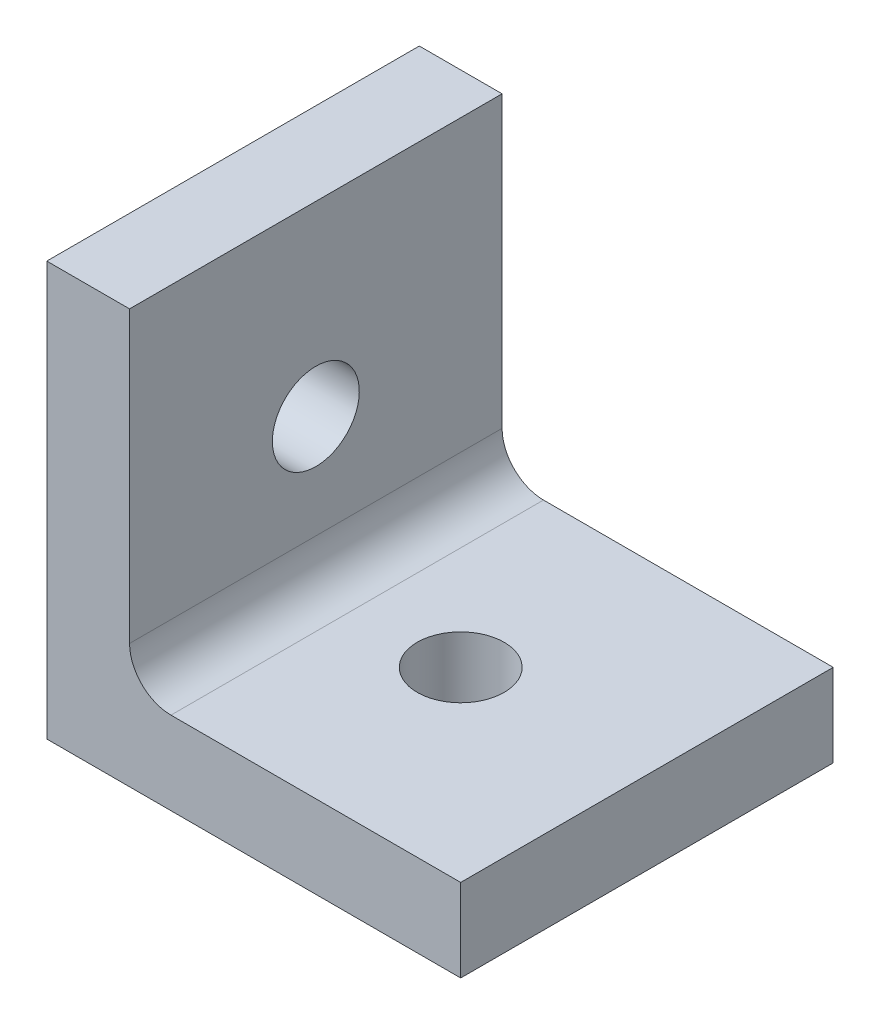
ISO-10303-21;
HEADER;
FILE_DESCRIPTION(('STEP AP214'),'2;1');
FILE_NAME('part.step','',(''),(''),'','','');
FILE_SCHEMA(('AUTOMOTIVE_DESIGN { 1 0 10303 214 1 1 1 1 }'));
ENDSEC;
DATA;
#1=APPLICATION_CONTEXT('core data for automotive mechanical design processes');
#2=APPLICATION_PROTOCOL_DEFINITION('international standard','automotive_design',2000,#1);
#3=PRODUCT_CONTEXT('',#1,'mechanical');
#4=PRODUCT('Part','Part','',(#3));
#5=PRODUCT_RELATED_PRODUCT_CATEGORY('part','',(#4));
#6=PRODUCT_DEFINITION_FORMATION('','',#4);
#7=PRODUCT_DEFINITION_CONTEXT('part definition',#1,'design');
#8=PRODUCT_DEFINITION('design','',#6,#7);
#9=PRODUCT_DEFINITION_SHAPE('','',#8);
#10=(LENGTH_UNIT() NAMED_UNIT(*) SI_UNIT(.MILLI.,.METRE.));
#11=(NAMED_UNIT(*) PLANE_ANGLE_UNIT() SI_UNIT($,.RADIAN.));
#12=(NAMED_UNIT(*) SI_UNIT($,.STERADIAN.) SOLID_ANGLE_UNIT());
#13=UNCERTAINTY_MEASURE_WITH_UNIT(LENGTH_MEASURE(1.E-05),#10,'distance_accuracy_value','');
#14=(GEOMETRIC_REPRESENTATION_CONTEXT(3) GLOBAL_UNCERTAINTY_ASSIGNED_CONTEXT((#13)) GLOBAL_UNIT_ASSIGNED_CONTEXT((#10,
#11,#12)) REPRESENTATION_CONTEXT('',''));
#15=CARTESIAN_POINT('',(0.,0.,0.));
#16=DIRECTION('',(0.,0.,1.));
#17=DIRECTION('',(1.,0.,0.));
#18=AXIS2_PLACEMENT_3D('',#15,#16,#17);
#19=CARTESIAN_POINT('',(0.,0.,18.));
#20=DIRECTION('',(1.,0.,0.));
#21=DIRECTION('',(0.,0.,-1.));
#22=AXIS2_PLACEMENT_3D('',#19,#20,#21);
#23=PLANE('',#22);
#24=CARTESIAN_POINT('',(0.,11.,9.));
#25=DIRECTION('',(1.,0.,0.));
#26=DIRECTION('',(0.,1.,0.));
#27=AXIS2_PLACEMENT_3D('',#24,#25,#26);
#28=CIRCLE('',#27,2.1);
#29=CARTESIAN_POINT('',(0.,13.1,9.));
#30=VERTEX_POINT('',#29);
#31=EDGE_CURVE('E164',#30,#30,#28,.T.);
#32=ORIENTED_EDGE('',*,*,#31,.T.);
#33=EDGE_LOOP('',(#32));
#34=FACE_BOUND('',#33,.T.);
#35=DIRECTION('',(0.,-1.,0.));
#36=VECTOR('',#35,1.);
#37=CARTESIAN_POINT('',(0.,0.,0.));
#38=LINE('',#37,#36);
#39=CARTESIAN_POINT('',(0.,20.,0.));
#40=VERTEX_POINT('',#39);
#41=CARTESIAN_POINT('',(0.,0.,0.));
#42=VERTEX_POINT('',#41);
#43=EDGE_CURVE('E124',#40,#42,#38,.T.);
#44=ORIENTED_EDGE('',*,*,#43,.T.);
#45=DIRECTION('',(0.,0.,-1.));
#46=VECTOR('',#45,1.);
#47=CARTESIAN_POINT('',(0.,0.,18.));
#48=LINE('',#47,#46);
#49=CARTESIAN_POINT('',(0.,0.,18.));
#50=VERTEX_POINT('',#49);
#51=EDGE_CURVE('E103',#50,#42,#48,.T.);
#52=ORIENTED_EDGE('',*,*,#51,.F.);
#53=DIRECTION('',(0.,-1.,0.));
#54=VECTOR('',#53,1.);
#55=CARTESIAN_POINT('',(0.,0.,18.));
#56=LINE('',#55,#54);
#57=CARTESIAN_POINT('',(0.,20.,18.));
#58=VERTEX_POINT('',#57);
#59=EDGE_CURVE('E111',#58,#50,#56,.T.);
#60=ORIENTED_EDGE('',*,*,#59,.F.);
#61=DIRECTION('',(0.,0.,-1.));
#62=VECTOR('',#61,1.);
#63=CARTESIAN_POINT('',(0.,20.,18.));
#64=LINE('',#63,#62);
#65=EDGE_CURVE('E145',#58,#40,#64,.T.);
#66=ORIENTED_EDGE('',*,*,#65,.T.);
#67=EDGE_LOOP('',(#44,#52,#60,#66));
#68=FACE_BOUND('',#67,.T.);
#69=ADVANCED_FACE('F39',(#34,#68),#23,.F.);
#70=CARTESIAN_POINT('',(0.,0.,18.));
#71=DIRECTION('',(0.,1.,0.));
#72=DIRECTION('',(0.,0.,1.));
#73=AXIS2_PLACEMENT_3D('',#70,#71,#72);
#74=PLANE('',#73);
#75=CARTESIAN_POINT('',(11.,0.,9.));
#76=DIRECTION('',(0.,1.,0.));
#77=DIRECTION('',(-1.,0.,0.));
#78=AXIS2_PLACEMENT_3D('',#75,#76,#77);
#79=CIRCLE('',#78,2.1);
#80=CARTESIAN_POINT('',(8.9,0.,9.));
#81=VERTEX_POINT('',#80);
#82=EDGE_CURVE('E179',#81,#81,#79,.T.);
#83=ORIENTED_EDGE('',*,*,#82,.T.);
#84=EDGE_LOOP('',(#83));
#85=FACE_BOUND('',#84,.T.);
#86=DIRECTION('',(1.,0.,0.));
#87=VECTOR('',#86,1.);
#88=CARTESIAN_POINT('',(0.,0.,0.));
#89=LINE('',#88,#87);
#90=CARTESIAN_POINT('',(20.,0.,0.));
#91=VERTEX_POINT('',#90);
#92=EDGE_CURVE('E159',#42,#91,#89,.T.);
#93=ORIENTED_EDGE('',*,*,#92,.T.);
#94=DIRECTION('',(0.,0.,-1.));
#95=VECTOR('',#94,1.);
#96=CARTESIAN_POINT('',(20.,0.,18.));
#97=LINE('',#96,#95);
#98=CARTESIAN_POINT('',(20.,0.,18.));
#99=VERTEX_POINT('',#98);
#100=EDGE_CURVE('E106',#99,#91,#97,.T.);
#101=ORIENTED_EDGE('',*,*,#100,.F.);
#102=DIRECTION('',(1.,0.,0.));
#103=VECTOR('',#102,1.);
#104=CARTESIAN_POINT('',(0.,0.,18.));
#105=LINE('',#104,#103);
#106=EDGE_CURVE('E99',#50,#99,#105,.T.);
#107=ORIENTED_EDGE('',*,*,#106,.F.);
#108=ORIENTED_EDGE('',*,*,#51,.T.);
#109=EDGE_LOOP('',(#93,#101,#107,#108));
#110=FACE_BOUND('',#109,.T.);
#111=ADVANCED_FACE('F101',(#85,#110),#74,.F.);
#112=CARTESIAN_POINT('',(20.,0.,18.));
#113=DIRECTION('',(-1.,0.,0.));
#114=DIRECTION('',(0.,-1.,0.));
#115=AXIS2_PLACEMENT_3D('',#112,#113,#114);
#116=PLANE('',#115);
#117=DIRECTION('',(0.,1.,0.));
#118=VECTOR('',#117,1.);
#119=CARTESIAN_POINT('',(20.,0.,0.));
#120=LINE('',#119,#118);
#121=CARTESIAN_POINT('',(20.,4.,0.));
#122=VERTEX_POINT('',#121);
#123=EDGE_CURVE('E156',#91,#122,#120,.T.);
#124=ORIENTED_EDGE('',*,*,#123,.T.);
#125=DIRECTION('',(0.,0.,-1.));
#126=VECTOR('',#125,1.);
#127=CARTESIAN_POINT('',(20.,4.,18.));
#128=LINE('',#127,#126);
#129=CARTESIAN_POINT('',(20.,4.,18.));
#130=VERTEX_POINT('',#129);
#131=EDGE_CURVE('E132',#130,#122,#128,.T.);
#132=ORIENTED_EDGE('',*,*,#131,.F.);
#133=DIRECTION('',(0.,1.,0.));
#134=VECTOR('',#133,1.);
#135=CARTESIAN_POINT('',(20.,0.,18.));
#136=LINE('',#135,#134);
#137=EDGE_CURVE('E110',#99,#130,#136,.T.);
#138=ORIENTED_EDGE('',*,*,#137,.F.);
#139=ORIENTED_EDGE('',*,*,#100,.T.);
#140=EDGE_LOOP('',(#124,#132,#138,#139));
#141=FACE_BOUND('',#140,.T.);
#142=ADVANCED_FACE('F202',(#141),#116,.F.);
#143=CARTESIAN_POINT('',(20.,4.,18.));
#144=DIRECTION('',(0.,-1.,0.));
#145=DIRECTION('',(1.,0.,0.));
#146=AXIS2_PLACEMENT_3D('',#143,#144,#145);
#147=PLANE('',#146);
#148=CARTESIAN_POINT('',(11.,4.,9.));
#149=DIRECTION('',(0.,1.,0.));
#150=DIRECTION('',(-1.,0.,0.));
#151=AXIS2_PLACEMENT_3D('',#148,#149,#150);
#152=CIRCLE('',#151,2.1);
#153=CARTESIAN_POINT('',(8.9,4.,9.));
#154=VERTEX_POINT('',#153);
#155=EDGE_CURVE('E183',#154,#154,#152,.T.);
#156=ORIENTED_EDGE('',*,*,#155,.F.);
#157=EDGE_LOOP('',(#156));
#158=FACE_BOUND('',#157,.T.);
#159=DIRECTION('',(-1.,0.,0.));
#160=VECTOR('',#159,1.);
#161=CARTESIAN_POINT('',(20.,4.,0.));
#162=LINE('',#161,#160);
#163=CARTESIAN_POINT('',(6.,4.,0.));
#164=VERTEX_POINT('',#163);
#165=EDGE_CURVE('E153',#122,#164,#162,.T.);
#166=ORIENTED_EDGE('',*,*,#165,.T.);
#167=DIRECTION('',(0.,0.,-1.));
#168=VECTOR('',#167,1.);
#169=CARTESIAN_POINT('',(6.,4.,18.));
#170=LINE('',#169,#168);
#171=CARTESIAN_POINT('',(6.,4.,18.));
#172=VERTEX_POINT('',#171);
#173=EDGE_CURVE('E55',#164,#172,#170,.F.);
#174=ORIENTED_EDGE('',*,*,#173,.T.);
#175=DIRECTION('',(-1.,0.,0.));
#176=VECTOR('',#175,1.);
#177=CARTESIAN_POINT('',(20.,4.,18.));
#178=LINE('',#177,#176);
#179=EDGE_CURVE('E170',#130,#172,#178,.T.);
#180=ORIENTED_EDGE('',*,*,#179,.F.);
#181=ORIENTED_EDGE('',*,*,#131,.T.);
#182=EDGE_LOOP('',(#166,#174,#180,#181));
#183=FACE_BOUND('',#182,.T.);
#184=ADVANCED_FACE('F199',(#158,#183),#147,.F.);
#185=CARTESIAN_POINT('',(4.,20.,18.));
#186=DIRECTION('',(-1.,0.,0.));
#187=DIRECTION('',(0.,-1.,0.));
#188=AXIS2_PLACEMENT_3D('',#185,#186,#187);
#189=PLANE('',#188);
#190=CARTESIAN_POINT('',(4.,11.,9.));
#191=DIRECTION('',(1.,0.,0.));
#192=DIRECTION('',(0.,1.,0.));
#193=AXIS2_PLACEMENT_3D('',#190,#191,#192);
#194=CIRCLE('',#193,2.1);
#195=CARTESIAN_POINT('',(4.,13.1,9.));
#196=VERTEX_POINT('',#195);
#197=EDGE_CURVE('E175',#196,#196,#194,.T.);
#198=ORIENTED_EDGE('',*,*,#197,.F.);
#199=EDGE_LOOP('',(#198));
#200=FACE_BOUND('',#199,.T.);
#201=DIRECTION('',(0.,1.,0.));
#202=VECTOR('',#201,1.);
#203=CARTESIAN_POINT('',(4.,20.,18.));
#204=LINE('',#203,#202);
#205=CARTESIAN_POINT('',(4.,6.,18.));
#206=VERTEX_POINT('',#205);
#207=CARTESIAN_POINT('',(4.,20.,18.));
#208=VERTEX_POINT('',#207);
#209=EDGE_CURVE('E167',#206,#208,#204,.T.);
#210=ORIENTED_EDGE('',*,*,#209,.F.);
#211=DIRECTION('',(0.,0.,-1.));
#212=VECTOR('',#211,1.);
#213=CARTESIAN_POINT('',(4.,6.,0.));
#214=LINE('',#213,#212);
#215=CARTESIAN_POINT('',(4.,6.,0.));
#216=VERTEX_POINT('',#215);
#217=EDGE_CURVE('E126',#206,#216,#214,.T.);
#218=ORIENTED_EDGE('',*,*,#217,.T.);
#219=DIRECTION('',(0.,1.,0.));
#220=VECTOR('',#219,1.);
#221=CARTESIAN_POINT('',(4.,20.,0.));
#222=LINE('',#221,#220);
#223=CARTESIAN_POINT('',(4.,20.,0.));
#224=VERTEX_POINT('',#223);
#225=EDGE_CURVE('E150',#216,#224,#222,.T.);
#226=ORIENTED_EDGE('',*,*,#225,.T.);
#227=DIRECTION('',(0.,0.,-1.));
#228=VECTOR('',#227,1.);
#229=CARTESIAN_POINT('',(4.,20.,18.));
#230=LINE('',#229,#228);
#231=EDGE_CURVE('E141',#208,#224,#230,.T.);
#232=ORIENTED_EDGE('',*,*,#231,.F.);
#233=EDGE_LOOP('',(#210,#218,#226,#232));
#234=FACE_BOUND('',#233,.T.);
#235=ADVANCED_FACE('F201',(#200,#234),#189,.F.);
#236=CARTESIAN_POINT('',(0.,20.,18.));
#237=DIRECTION('',(0.,-1.,0.));
#238=DIRECTION('',(1.,0.,0.));
#239=AXIS2_PLACEMENT_3D('',#236,#237,#238);
#240=PLANE('',#239);
#241=DIRECTION('',(-1.,0.,0.));
#242=VECTOR('',#241,1.);
#243=CARTESIAN_POINT('',(0.,20.,0.));
#244=LINE('',#243,#242);
#245=EDGE_CURVE('E121',#224,#40,#244,.T.);
#246=ORIENTED_EDGE('',*,*,#245,.T.);
#247=ORIENTED_EDGE('',*,*,#65,.F.);
#248=DIRECTION('',(-1.,0.,0.));
#249=VECTOR('',#248,1.);
#250=CARTESIAN_POINT('',(0.,20.,18.));
#251=LINE('',#250,#249);
#252=EDGE_CURVE('E116',#208,#58,#251,.T.);
#253=ORIENTED_EDGE('',*,*,#252,.F.);
#254=ORIENTED_EDGE('',*,*,#231,.T.);
#255=EDGE_LOOP('',(#246,#247,#253,#254));
#256=FACE_BOUND('',#255,.T.);
#257=ADVANCED_FACE('F214',(#256),#240,.F.);
#258=CARTESIAN_POINT('',(0.,0.,18.));
#259=DIRECTION('',(0.,0.,-1.));
#260=DIRECTION('',(-1.,0.,0.));
#261=AXIS2_PLACEMENT_3D('',#258,#259,#260);
#262=PLANE('',#261);
#263=ORIENTED_EDGE('',*,*,#59,.T.);
#264=ORIENTED_EDGE('',*,*,#106,.T.);
#265=ORIENTED_EDGE('',*,*,#137,.T.);
#266=ORIENTED_EDGE('',*,*,#179,.T.);
#267=CARTESIAN_POINT('',(6.,6.,18.));
#268=DIRECTION('',(0.,0.,-1.));
#269=DIRECTION('',(-1.,0.,0.));
#270=AXIS2_PLACEMENT_3D('',#267,#268,#269);
#271=CIRCLE('',#270,2.);
#272=EDGE_CURVE('E11',#172,#206,#271,.T.);
#273=ORIENTED_EDGE('',*,*,#272,.T.);
#274=ORIENTED_EDGE('',*,*,#209,.T.);
#275=ORIENTED_EDGE('',*,*,#252,.T.);
#276=EDGE_LOOP('',(#263,#264,#265,#266,#273,#274,#275));
#277=FACE_BOUND('',#276,.T.);
#278=ADVANCED_FACE('F114',(#277),#262,.F.);
#279=CARTESIAN_POINT('',(0.,0.,0.));
#280=DIRECTION('',(0.,0.,-1.));
#281=DIRECTION('',(-1.,0.,0.));
#282=AXIS2_PLACEMENT_3D('',#279,#280,#281);
#283=PLANE('',#282);
#284=ORIENTED_EDGE('',*,*,#43,.F.);
#285=ORIENTED_EDGE('',*,*,#245,.F.);
#286=ORIENTED_EDGE('',*,*,#225,.F.);
#287=CARTESIAN_POINT('',(6.,6.,0.));
#288=DIRECTION('',(0.,0.,-1.));
#289=DIRECTION('',(-1.,0.,0.));
#290=AXIS2_PLACEMENT_3D('',#287,#288,#289);
#291=CIRCLE('',#290,2.);
#292=EDGE_CURVE('E48',#216,#164,#291,.F.);
#293=ORIENTED_EDGE('',*,*,#292,.T.);
#294=ORIENTED_EDGE('',*,*,#165,.F.);
#295=ORIENTED_EDGE('',*,*,#123,.F.);
#296=ORIENTED_EDGE('',*,*,#92,.F.);
#297=EDGE_LOOP('',(#284,#285,#286,#293,#294,#295,#296));
#298=FACE_BOUND('',#297,.T.);
#299=ADVANCED_FACE('F215',(#298),#283,.T.);
#300=CARTESIAN_POINT('',(0.,11.,9.));
#301=DIRECTION('',(1.,0.,0.));
#302=DIRECTION('',(0.,1.,0.));
#303=AXIS2_PLACEMENT_3D('',#300,#301,#302);
#304=CYLINDRICAL_SURFACE('',#303,2.1);
#305=ORIENTED_EDGE('',*,*,#31,.F.);
#306=EDGE_LOOP('',(#305));
#307=FACE_BOUND('',#306,.T.);
#308=ORIENTED_EDGE('',*,*,#197,.T.);
#309=EDGE_LOOP('',(#308));
#310=FACE_BOUND('',#309,.T.);
#311=ADVANCED_FACE('F195',(#307,#310),#304,.F.);
#312=CARTESIAN_POINT('',(11.,0.,9.));
#313=DIRECTION('',(0.,1.,0.));
#314=DIRECTION('',(-1.,0.,0.));
#315=AXIS2_PLACEMENT_3D('',#312,#313,#314);
#316=CYLINDRICAL_SURFACE('',#315,2.1);
#317=ORIENTED_EDGE('',*,*,#82,.F.);
#318=EDGE_LOOP('',(#317));
#319=FACE_BOUND('',#318,.T.);
#320=ORIENTED_EDGE('',*,*,#155,.T.);
#321=EDGE_LOOP('',(#320));
#322=FACE_BOUND('',#321,.T.);
#323=ADVANCED_FACE('F192',(#319,#322),#316,.F.);
#324=CARTESIAN_POINT('',(6.,6.,18.));
#325=DIRECTION('',(0.,0.,1.));
#326=DIRECTION('',(1.,0.,0.));
#327=AXIS2_PLACEMENT_3D('',#324,#325,#326);
#328=CYLINDRICAL_SURFACE('',#327,2.);
#329=ORIENTED_EDGE('',*,*,#272,.F.);
#330=ORIENTED_EDGE('',*,*,#173,.F.);
#331=ORIENTED_EDGE('',*,*,#292,.F.);
#332=ORIENTED_EDGE('',*,*,#217,.F.);
#333=EDGE_LOOP('',(#329,#330,#331,#332));
#334=FACE_BOUND('',#333,.T.);
#335=ADVANCED_FACE('F41',(#334),#328,.F.);
#336=CLOSED_SHELL('',(#69,#111,#142,#184,#235,#257,#278,#299,#311,#323,#335));
#337=MANIFOLD_SOLID_BREP('B2',#336);
#338=ADVANCED_BREP_SHAPE_REPRESENTATION('',(#18,#337),#14);
#339=SHAPE_DEFINITION_REPRESENTATION(#9,#338);
ENDSEC;
END-ISO-10303-21;
